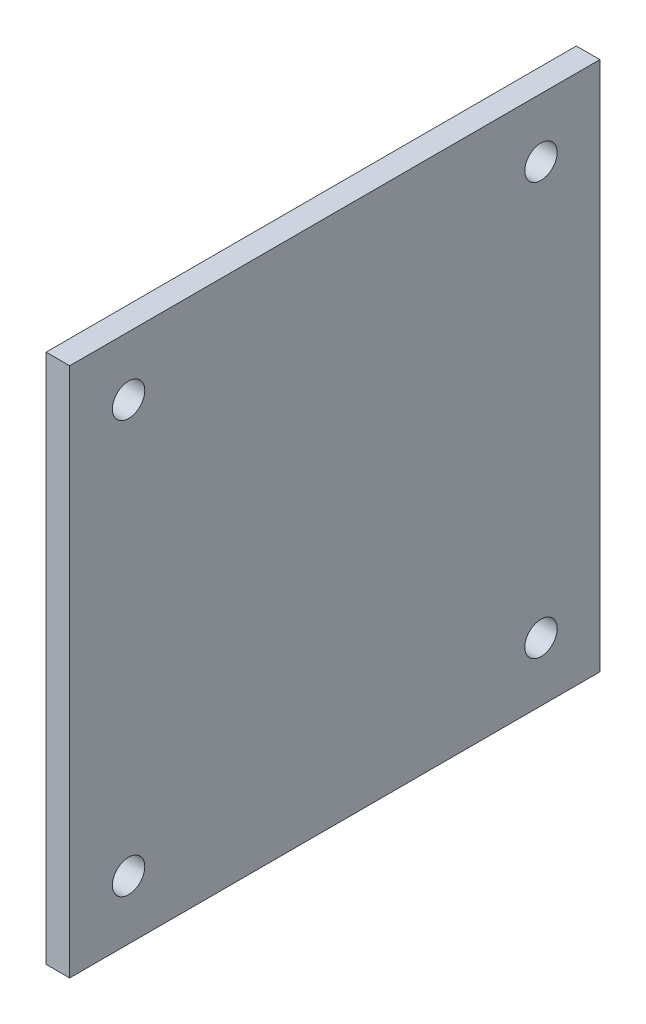
ISO-10303-21;
HEADER;
FILE_DESCRIPTION(('STEP AP214'),'2;1');
FILE_NAME('part.step','',(''),(''),'','','');
FILE_SCHEMA(('AUTOMOTIVE_DESIGN { 1 0 10303 214 1 1 1 1 }'));
ENDSEC;
DATA;
#1=APPLICATION_CONTEXT('core data for automotive mechanical design processes');
#2=APPLICATION_PROTOCOL_DEFINITION('international standard','automotive_design',2000,#1);
#3=PRODUCT_CONTEXT('',#1,'mechanical');
#4=PRODUCT('Part','Part','',(#3));
#5=PRODUCT_RELATED_PRODUCT_CATEGORY('part','',(#4));
#6=PRODUCT_DEFINITION_FORMATION('','',#4);
#7=PRODUCT_DEFINITION_CONTEXT('part definition',#1,'design');
#8=PRODUCT_DEFINITION('design','',#6,#7);
#9=PRODUCT_DEFINITION_SHAPE('','',#8);
#10=(LENGTH_UNIT() NAMED_UNIT(*) SI_UNIT(.MILLI.,.METRE.));
#11=(NAMED_UNIT(*) PLANE_ANGLE_UNIT() SI_UNIT($,.RADIAN.));
#12=(NAMED_UNIT(*) SI_UNIT($,.STERADIAN.) SOLID_ANGLE_UNIT());
#13=UNCERTAINTY_MEASURE_WITH_UNIT(LENGTH_MEASURE(1.E-05),#10,'distance_accuracy_value','');
#14=(GEOMETRIC_REPRESENTATION_CONTEXT(3) GLOBAL_UNCERTAINTY_ASSIGNED_CONTEXT((#13)) GLOBAL_UNIT_ASSIGNED_CONTEXT((#10,
#11,#12)) REPRESENTATION_CONTEXT('',''));
#15=CARTESIAN_POINT('',(0.,0.,0.));
#16=DIRECTION('',(0.,0.,1.));
#17=DIRECTION('',(1.,0.,0.));
#18=AXIS2_PLACEMENT_3D('',#15,#16,#17);
#19=CARTESIAN_POINT('',(-39.2,-18.,18.));
#20=DIRECTION('',(0.,-1.,0.));
#21=DIRECTION('',(0.,0.,-1.));
#22=AXIS2_PLACEMENT_3D('',#19,#20,#21);
#23=PLANE('',#22);
#24=DIRECTION('',(0.,0.,-1.));
#25=VECTOR('',#24,1.);
#26=CARTESIAN_POINT('',(-37.6,-18.,18.));
#27=LINE('',#26,#25);
#28=CARTESIAN_POINT('',(-37.6,-18.,18.));
#29=VERTEX_POINT('',#28);
#30=CARTESIAN_POINT('',(-37.6,-18.,-18.));
#31=VERTEX_POINT('',#30);
#32=EDGE_CURVE('E175',#29,#31,#27,.T.);
#33=ORIENTED_EDGE('',*,*,#32,.F.);
#34=DIRECTION('',(1.,0.,0.));
#35=VECTOR('',#34,1.);
#36=CARTESIAN_POINT('',(-39.2,-18.,18.));
#37=LINE('',#36,#35);
#38=CARTESIAN_POINT('',(-39.2,-18.,18.));
#39=VERTEX_POINT('',#38);
#40=EDGE_CURVE('E11',#39,#29,#37,.T.);
#41=ORIENTED_EDGE('',*,*,#40,.F.);
#42=DIRECTION('',(0.,0.,-1.));
#43=VECTOR('',#42,1.);
#44=CARTESIAN_POINT('',(-39.2,-18.,18.));
#45=LINE('',#44,#43);
#46=CARTESIAN_POINT('',(-39.2,-18.,-18.));
#47=VERTEX_POINT('',#46);
#48=EDGE_CURVE('E176',#39,#47,#45,.T.);
#49=ORIENTED_EDGE('',*,*,#48,.T.);
#50=DIRECTION('',(1.,0.,0.));
#51=VECTOR('',#50,1.);
#52=CARTESIAN_POINT('',(-39.2,-18.,-18.));
#53=LINE('',#52,#51);
#54=EDGE_CURVE('E42',#47,#31,#53,.T.);
#55=ORIENTED_EDGE('',*,*,#54,.T.);
#56=EDGE_LOOP('',(#33,#41,#49,#55));
#57=FACE_BOUND('',#56,.T.);
#58=ADVANCED_FACE('F41',(#57),#23,.T.);
#59=CARTESIAN_POINT('',(-39.2,18.,18.));
#60=DIRECTION('',(0.,0.,1.));
#61=DIRECTION('',(1.,0.,0.));
#62=AXIS2_PLACEMENT_3D('',#59,#60,#61);
#63=PLANE('',#62);
#64=DIRECTION('',(0.,-1.,0.));
#65=VECTOR('',#64,1.);
#66=CARTESIAN_POINT('',(-37.6,18.,18.));
#67=LINE('',#66,#65);
#68=CARTESIAN_POINT('',(-37.6,18.,18.));
#69=VERTEX_POINT('',#68);
#70=EDGE_CURVE('E177',#69,#29,#67,.T.);
#71=ORIENTED_EDGE('',*,*,#70,.F.);
#72=DIRECTION('',(1.,0.,0.));
#73=VECTOR('',#72,1.);
#74=CARTESIAN_POINT('',(-39.2,18.,18.));
#75=LINE('',#74,#73);
#76=CARTESIAN_POINT('',(-39.2,18.,18.));
#77=VERTEX_POINT('',#76);
#78=EDGE_CURVE('E47',#77,#69,#75,.T.);
#79=ORIENTED_EDGE('',*,*,#78,.F.);
#80=DIRECTION('',(0.,-1.,0.));
#81=VECTOR('',#80,1.);
#82=CARTESIAN_POINT('',(-39.2,18.,18.));
#83=LINE('',#82,#81);
#84=EDGE_CURVE('E184',#77,#39,#83,.T.);
#85=ORIENTED_EDGE('',*,*,#84,.T.);
#86=ORIENTED_EDGE('',*,*,#40,.T.);
#87=EDGE_LOOP('',(#71,#79,#85,#86));
#88=FACE_BOUND('',#87,.T.);
#89=ADVANCED_FACE('F203',(#88),#63,.T.);
#90=CARTESIAN_POINT('',(-39.2,18.,-18.));
#91=DIRECTION('',(0.,1.,0.));
#92=DIRECTION('',(0.,0.,1.));
#93=AXIS2_PLACEMENT_3D('',#90,#91,#92);
#94=PLANE('',#93);
#95=DIRECTION('',(0.,0.,1.));
#96=VECTOR('',#95,1.);
#97=CARTESIAN_POINT('',(-37.6,18.,-18.));
#98=LINE('',#97,#96);
#99=CARTESIAN_POINT('',(-37.6,18.,-18.));
#100=VERTEX_POINT('',#99);
#101=EDGE_CURVE('E191',#100,#69,#98,.T.);
#102=ORIENTED_EDGE('',*,*,#101,.F.);
#103=DIRECTION('',(1.,0.,0.));
#104=VECTOR('',#103,1.);
#105=CARTESIAN_POINT('',(-39.2,18.,-18.));
#106=LINE('',#105,#104);
#107=CARTESIAN_POINT('',(-39.2,18.,-18.));
#108=VERTEX_POINT('',#107);
#109=EDGE_CURVE('E198',#108,#100,#106,.T.);
#110=ORIENTED_EDGE('',*,*,#109,.F.);
#111=DIRECTION('',(0.,0.,1.));
#112=VECTOR('',#111,1.);
#113=CARTESIAN_POINT('',(-39.2,18.,-18.));
#114=LINE('',#113,#112);
#115=EDGE_CURVE('E182',#108,#77,#114,.T.);
#116=ORIENTED_EDGE('',*,*,#115,.T.);
#117=ORIENTED_EDGE('',*,*,#78,.T.);
#118=EDGE_LOOP('',(#102,#110,#116,#117));
#119=FACE_BOUND('',#118,.T.);
#120=ADVANCED_FACE('F202',(#119),#94,.T.);
#121=CARTESIAN_POINT('',(-39.2,-18.,-18.));
#122=DIRECTION('',(0.,0.,-1.));
#123=DIRECTION('',(-1.,0.,0.));
#124=AXIS2_PLACEMENT_3D('',#121,#122,#123);
#125=PLANE('',#124);
#126=DIRECTION('',(0.,1.,0.));
#127=VECTOR('',#126,1.);
#128=CARTESIAN_POINT('',(-37.6,-18.,-18.));
#129=LINE('',#128,#127);
#130=EDGE_CURVE('E190',#31,#100,#129,.T.);
#131=ORIENTED_EDGE('',*,*,#130,.F.);
#132=ORIENTED_EDGE('',*,*,#54,.F.);
#133=DIRECTION('',(0.,1.,0.));
#134=VECTOR('',#133,1.);
#135=CARTESIAN_POINT('',(-39.2,-18.,-18.));
#136=LINE('',#135,#134);
#137=EDGE_CURVE('E178',#47,#108,#136,.T.);
#138=ORIENTED_EDGE('',*,*,#137,.T.);
#139=ORIENTED_EDGE('',*,*,#109,.T.);
#140=EDGE_LOOP('',(#131,#132,#138,#139));
#141=FACE_BOUND('',#140,.T.);
#142=ADVANCED_FACE('F196',(#141),#125,.T.);
#143=CARTESIAN_POINT('',(-39.2,0.,0.));
#144=DIRECTION('',(1.,0.,0.));
#145=DIRECTION('',(0.,0.,-1.));
#146=AXIS2_PLACEMENT_3D('',#143,#144,#145);
#147=PLANE('',#146);
#148=DIRECTION('',(0.,-1.,0.));
#149=VECTOR('',#148,1.);
#150=CARTESIAN_POINT('',(-39.2,12.8,11.35));
#151=LINE('',#150,#149);
#152=CARTESIAN_POINT('',(-39.2,12.8,11.35));
#153=VERTEX_POINT('',#152);
#154=CARTESIAN_POINT('',(-39.2,-12.8,11.35));
#155=VERTEX_POINT('',#154);
#156=EDGE_CURVE('E133',#153,#155,#151,.T.);
#157=ORIENTED_EDGE('',*,*,#156,.T.);
#158=DIRECTION('',(0.,0.,-1.));
#159=VECTOR('',#158,1.);
#160=CARTESIAN_POINT('',(-39.2,-12.8,11.35));
#161=LINE('',#160,#159);
#162=CARTESIAN_POINT('',(-39.2,-12.8,-11.35));
#163=VERTEX_POINT('',#162);
#164=EDGE_CURVE('E60',#155,#163,#161,.T.);
#165=ORIENTED_EDGE('',*,*,#164,.T.);
#166=DIRECTION('',(0.,1.,0.));
#167=VECTOR('',#166,1.);
#168=CARTESIAN_POINT('',(-39.2,-12.8,-11.35));
#169=LINE('',#168,#167);
#170=CARTESIAN_POINT('',(-39.2,12.8,-11.35));
#171=VERTEX_POINT('',#170);
#172=EDGE_CURVE('E120',#163,#171,#169,.T.);
#173=ORIENTED_EDGE('',*,*,#172,.T.);
#174=DIRECTION('',(0.,0.,1.));
#175=VECTOR('',#174,1.);
#176=CARTESIAN_POINT('',(-39.2,12.8,-11.35));
#177=LINE('',#176,#175);
#178=EDGE_CURVE('E138',#171,#153,#177,.T.);
#179=ORIENTED_EDGE('',*,*,#178,.T.);
#180=EDGE_LOOP('',(#157,#165,#173,#179));
#181=FACE_BOUND('',#180,.T.);
#182=CARTESIAN_POINT('',(-39.2,14.,14.));
#183=DIRECTION('',(1.,0.,0.));
#184=DIRECTION('',(0.,0.,-1.));
#185=AXIS2_PLACEMENT_3D('',#182,#183,#184);
#186=CIRCLE('',#185,1.1);
#187=CARTESIAN_POINT('',(-39.2,14.,12.9));
#188=VERTEX_POINT('',#187);
#189=EDGE_CURVE('E155',#188,#188,#186,.T.);
#190=ORIENTED_EDGE('',*,*,#189,.T.);
#191=EDGE_LOOP('',(#190));
#192=FACE_BOUND('',#191,.T.);
#193=CARTESIAN_POINT('',(-39.2,14.,-14.));
#194=DIRECTION('',(1.,0.,0.));
#195=DIRECTION('',(0.,0.,-1.));
#196=AXIS2_PLACEMENT_3D('',#193,#194,#195);
#197=CIRCLE('',#196,1.1);
#198=CARTESIAN_POINT('',(-39.2,14.,-15.1));
#199=VERTEX_POINT('',#198);
#200=EDGE_CURVE('E158',#199,#199,#197,.T.);
#201=ORIENTED_EDGE('',*,*,#200,.T.);
#202=EDGE_LOOP('',(#201));
#203=FACE_BOUND('',#202,.T.);
#204=CARTESIAN_POINT('',(-39.2,-14.,14.));
#205=DIRECTION('',(1.,0.,0.));
#206=DIRECTION('',(0.,0.,-1.));
#207=AXIS2_PLACEMENT_3D('',#204,#205,#206);
#208=CIRCLE('',#207,1.1);
#209=CARTESIAN_POINT('',(-39.2,-14.,12.9));
#210=VERTEX_POINT('',#209);
#211=EDGE_CURVE('E163',#210,#210,#208,.T.);
#212=ORIENTED_EDGE('',*,*,#211,.T.);
#213=EDGE_LOOP('',(#212));
#214=FACE_BOUND('',#213,.T.);
#215=CARTESIAN_POINT('',(-39.2,-14.,-14.));
#216=DIRECTION('',(1.,0.,0.));
#217=DIRECTION('',(0.,0.,-1.));
#218=AXIS2_PLACEMENT_3D('',#215,#216,#217);
#219=CIRCLE('',#218,1.1);
#220=CARTESIAN_POINT('',(-39.2,-14.,-15.1));
#221=VERTEX_POINT('',#220);
#222=EDGE_CURVE('E168',#221,#221,#219,.T.);
#223=ORIENTED_EDGE('',*,*,#222,.T.);
#224=EDGE_LOOP('',(#223));
#225=FACE_BOUND('',#224,.T.);
#226=ORIENTED_EDGE('',*,*,#48,.F.);
#227=ORIENTED_EDGE('',*,*,#84,.F.);
#228=ORIENTED_EDGE('',*,*,#115,.F.);
#229=ORIENTED_EDGE('',*,*,#137,.F.);
#230=EDGE_LOOP('',(#226,#227,#228,#229));
#231=FACE_BOUND('',#230,.T.);
#232=ADVANCED_FACE('F210',(#181,#192,#203,#214,#225,#231),#147,.F.);
#233=CARTESIAN_POINT('',(-37.6,0.,0.));
#234=DIRECTION('',(1.,0.,0.));
#235=DIRECTION('',(0.,0.,-1.));
#236=AXIS2_PLACEMENT_3D('',#233,#234,#235);
#237=PLANE('',#236);
#238=CARTESIAN_POINT('',(-37.6,14.,14.));
#239=DIRECTION('',(1.,0.,0.));
#240=DIRECTION('',(0.,0.,-1.));
#241=AXIS2_PLACEMENT_3D('',#238,#239,#240);
#242=CIRCLE('',#241,1.1);
#243=CARTESIAN_POINT('',(-37.6,14.,12.9));
#244=VERTEX_POINT('',#243);
#245=EDGE_CURVE('E146',#244,#244,#242,.T.);
#246=ORIENTED_EDGE('',*,*,#245,.F.);
#247=EDGE_LOOP('',(#246));
#248=FACE_BOUND('',#247,.T.);
#249=CARTESIAN_POINT('',(-37.6,14.,-14.));
#250=DIRECTION('',(1.,0.,0.));
#251=DIRECTION('',(0.,0.,-1.));
#252=AXIS2_PLACEMENT_3D('',#249,#250,#251);
#253=CIRCLE('',#252,1.1);
#254=CARTESIAN_POINT('',(-37.6,14.,-15.1));
#255=VERTEX_POINT('',#254);
#256=EDGE_CURVE('E154',#255,#255,#253,.T.);
#257=ORIENTED_EDGE('',*,*,#256,.F.);
#258=EDGE_LOOP('',(#257));
#259=FACE_BOUND('',#258,.T.);
#260=CARTESIAN_POINT('',(-37.6,-14.,14.));
#261=DIRECTION('',(1.,0.,0.));
#262=DIRECTION('',(0.,0.,-1.));
#263=AXIS2_PLACEMENT_3D('',#260,#261,#262);
#264=CIRCLE('',#263,1.1);
#265=CARTESIAN_POINT('',(-37.6,-14.,12.9));
#266=VERTEX_POINT('',#265);
#267=EDGE_CURVE('E161',#266,#266,#264,.T.);
#268=ORIENTED_EDGE('',*,*,#267,.F.);
#269=EDGE_LOOP('',(#268));
#270=FACE_BOUND('',#269,.T.);
#271=CARTESIAN_POINT('',(-37.6,-14.,-14.));
#272=DIRECTION('',(1.,0.,0.));
#273=DIRECTION('',(0.,0.,-1.));
#274=AXIS2_PLACEMENT_3D('',#271,#272,#273);
#275=CIRCLE('',#274,1.1);
#276=CARTESIAN_POINT('',(-37.6,-14.,-15.1));
#277=VERTEX_POINT('',#276);
#278=EDGE_CURVE('E170',#277,#277,#275,.T.);
#279=ORIENTED_EDGE('',*,*,#278,.F.);
#280=EDGE_LOOP('',(#279));
#281=FACE_BOUND('',#280,.T.);
#282=ORIENTED_EDGE('',*,*,#32,.T.);
#283=ORIENTED_EDGE('',*,*,#130,.T.);
#284=ORIENTED_EDGE('',*,*,#101,.T.);
#285=ORIENTED_EDGE('',*,*,#70,.T.);
#286=EDGE_LOOP('',(#282,#283,#284,#285));
#287=FACE_BOUND('',#286,.T.);
#288=ADVANCED_FACE('F199',(#248,#259,#270,#281,#287),#237,.T.);
#289=CARTESIAN_POINT('',(-39.2,-14.,-14.));
#290=DIRECTION('',(1.,0.,0.));
#291=DIRECTION('',(0.,0.,-1.));
#292=AXIS2_PLACEMENT_3D('',#289,#290,#291);
#293=CYLINDRICAL_SURFACE('',#292,1.1);
#294=ORIENTED_EDGE('',*,*,#222,.F.);
#295=EDGE_LOOP('',(#294));
#296=FACE_BOUND('',#295,.T.);
#297=ORIENTED_EDGE('',*,*,#278,.T.);
#298=EDGE_LOOP('',(#297));
#299=FACE_BOUND('',#298,.T.);
#300=ADVANCED_FACE('F216',(#296,#299),#293,.F.);
#301=CARTESIAN_POINT('',(-39.2,-14.,14.));
#302=DIRECTION('',(1.,0.,0.));
#303=DIRECTION('',(0.,0.,-1.));
#304=AXIS2_PLACEMENT_3D('',#301,#302,#303);
#305=CYLINDRICAL_SURFACE('',#304,1.1);
#306=ORIENTED_EDGE('',*,*,#211,.F.);
#307=EDGE_LOOP('',(#306));
#308=FACE_BOUND('',#307,.T.);
#309=ORIENTED_EDGE('',*,*,#267,.T.);
#310=EDGE_LOOP('',(#309));
#311=FACE_BOUND('',#310,.T.);
#312=ADVANCED_FACE('F249',(#308,#311),#305,.F.);
#313=CARTESIAN_POINT('',(-39.2,14.,-14.));
#314=DIRECTION('',(1.,0.,0.));
#315=DIRECTION('',(0.,0.,-1.));
#316=AXIS2_PLACEMENT_3D('',#313,#314,#315);
#317=CYLINDRICAL_SURFACE('',#316,1.1);
#318=ORIENTED_EDGE('',*,*,#200,.F.);
#319=EDGE_LOOP('',(#318));
#320=FACE_BOUND('',#319,.T.);
#321=ORIENTED_EDGE('',*,*,#256,.T.);
#322=EDGE_LOOP('',(#321));
#323=FACE_BOUND('',#322,.T.);
#324=ADVANCED_FACE('F256',(#320,#323),#317,.F.);
#325=CARTESIAN_POINT('',(-39.2,14.,14.));
#326=DIRECTION('',(1.,0.,0.));
#327=DIRECTION('',(0.,0.,-1.));
#328=AXIS2_PLACEMENT_3D('',#325,#326,#327);
#329=CYLINDRICAL_SURFACE('',#328,1.1);
#330=ORIENTED_EDGE('',*,*,#189,.F.);
#331=EDGE_LOOP('',(#330));
#332=FACE_BOUND('',#331,.T.);
#333=ORIENTED_EDGE('',*,*,#245,.T.);
#334=EDGE_LOOP('',(#333));
#335=FACE_BOUND('',#334,.T.);
#336=ADVANCED_FACE('F266',(#332,#335),#329,.F.);
#337=CARTESIAN_POINT('',(-43.8,-12.8,11.35));
#338=DIRECTION('',(0.,-1.,0.));
#339=DIRECTION('',(0.,0.,-1.));
#340=AXIS2_PLACEMENT_3D('',#337,#338,#339);
#341=PLANE('',#340);
#342=ORIENTED_EDGE('',*,*,#164,.F.);
#343=DIRECTION('',(1.,0.,0.));
#344=VECTOR('',#343,1.);
#345=CARTESIAN_POINT('',(-43.8,-12.8,11.35));
#346=LINE('',#345,#344);
#347=CARTESIAN_POINT('',(-43.8,-12.8,11.35));
#348=VERTEX_POINT('',#347);
#349=EDGE_CURVE('E131',#348,#155,#346,.T.);
#350=ORIENTED_EDGE('',*,*,#349,.F.);
#351=DIRECTION('',(0.,0.,-1.));
#352=VECTOR('',#351,1.);
#353=CARTESIAN_POINT('',(-43.8,-12.8,11.35));
#354=LINE('',#353,#352);
#355=CARTESIAN_POINT('',(-43.8,-12.8,-11.35));
#356=VERTEX_POINT('',#355);
#357=EDGE_CURVE('E126',#348,#356,#354,.T.);
#358=ORIENTED_EDGE('',*,*,#357,.T.);
#359=DIRECTION('',(1.,0.,0.));
#360=VECTOR('',#359,1.);
#361=CARTESIAN_POINT('',(-43.8,-12.8,-11.35));
#362=LINE('',#361,#360);
#363=EDGE_CURVE('E114',#356,#163,#362,.T.);
#364=ORIENTED_EDGE('',*,*,#363,.T.);
#365=EDGE_LOOP('',(#342,#350,#358,#364));
#366=FACE_BOUND('',#365,.T.);
#367=ADVANCED_FACE('F135',(#366),#341,.T.);
#368=CARTESIAN_POINT('',(-43.8,12.8,11.35));
#369=DIRECTION('',(0.,0.,1.));
#370=DIRECTION('',(1.,0.,0.));
#371=AXIS2_PLACEMENT_3D('',#368,#369,#370);
#372=PLANE('',#371);
#373=ORIENTED_EDGE('',*,*,#156,.F.);
#374=DIRECTION('',(1.,0.,0.));
#375=VECTOR('',#374,1.);
#376=CARTESIAN_POINT('',(-43.8,12.8,11.35));
#377=LINE('',#376,#375);
#378=CARTESIAN_POINT('',(-43.8,12.8,11.35));
#379=VERTEX_POINT('',#378);
#380=EDGE_CURVE('E149',#379,#153,#377,.T.);
#381=ORIENTED_EDGE('',*,*,#380,.F.);
#382=DIRECTION('',(0.,-1.,0.));
#383=VECTOR('',#382,1.);
#384=CARTESIAN_POINT('',(-43.8,12.8,11.35));
#385=LINE('',#384,#383);
#386=EDGE_CURVE('E121',#379,#348,#385,.T.);
#387=ORIENTED_EDGE('',*,*,#386,.T.);
#388=ORIENTED_EDGE('',*,*,#349,.T.);
#389=EDGE_LOOP('',(#373,#381,#387,#388));
#390=FACE_BOUND('',#389,.T.);
#391=ADVANCED_FACE('F283',(#390),#372,.T.);
#392=CARTESIAN_POINT('',(-43.8,12.8,-11.35));
#393=DIRECTION('',(0.,1.,0.));
#394=DIRECTION('',(0.,0.,1.));
#395=AXIS2_PLACEMENT_3D('',#392,#393,#394);
#396=PLANE('',#395);
#397=ORIENTED_EDGE('',*,*,#178,.F.);
#398=DIRECTION('',(1.,0.,0.));
#399=VECTOR('',#398,1.);
#400=CARTESIAN_POINT('',(-43.8,12.8,-11.35));
#401=LINE('',#400,#399);
#402=CARTESIAN_POINT('',(-43.8,12.8,-11.35));
#403=VERTEX_POINT('',#402);
#404=EDGE_CURVE('E118',#403,#171,#401,.T.);
#405=ORIENTED_EDGE('',*,*,#404,.F.);
#406=DIRECTION('',(0.,0.,1.));
#407=VECTOR('',#406,1.);
#408=CARTESIAN_POINT('',(-43.8,12.8,-11.35));
#409=LINE('',#408,#407);
#410=EDGE_CURVE('E132',#403,#379,#409,.T.);
#411=ORIENTED_EDGE('',*,*,#410,.T.);
#412=ORIENTED_EDGE('',*,*,#380,.T.);
#413=EDGE_LOOP('',(#397,#405,#411,#412));
#414=FACE_BOUND('',#413,.T.);
#415=ADVANCED_FACE('F294',(#414),#396,.T.);
#416=CARTESIAN_POINT('',(-43.8,-12.8,-11.35));
#417=DIRECTION('',(0.,0.,-1.));
#418=DIRECTION('',(-1.,0.,0.));
#419=AXIS2_PLACEMENT_3D('',#416,#417,#418);
#420=PLANE('',#419);
#421=ORIENTED_EDGE('',*,*,#172,.F.);
#422=ORIENTED_EDGE('',*,*,#363,.F.);
#423=DIRECTION('',(0.,1.,0.));
#424=VECTOR('',#423,1.);
#425=CARTESIAN_POINT('',(-43.8,-12.8,-11.35));
#426=LINE('',#425,#424);
#427=EDGE_CURVE('E117',#356,#403,#426,.T.);
#428=ORIENTED_EDGE('',*,*,#427,.T.);
#429=ORIENTED_EDGE('',*,*,#404,.T.);
#430=EDGE_LOOP('',(#421,#422,#428,#429));
#431=FACE_BOUND('',#430,.T.);
#432=ADVANCED_FACE('F113',(#431),#420,.T.);
#433=CARTESIAN_POINT('',(-43.8,0.,0.));
#434=DIRECTION('',(1.,0.,0.));
#435=DIRECTION('',(0.,0.,-1.));
#436=AXIS2_PLACEMENT_3D('',#433,#434,#435);
#437=PLANE('',#436);
#438=ORIENTED_EDGE('',*,*,#357,.F.);
#439=ORIENTED_EDGE('',*,*,#386,.F.);
#440=ORIENTED_EDGE('',*,*,#410,.F.);
#441=ORIENTED_EDGE('',*,*,#427,.F.);
#442=EDGE_LOOP('',(#438,#439,#440,#441));
#443=FACE_BOUND('',#442,.T.);
#444=ADVANCED_FACE('F127',(#443),#437,.F.);
#445=CLOSED_SHELL('',(#58,#89,#120,#142,#232,#288,#300,#312,#324,#336,#367,#391,#415,#432,#444));
#446=MANIFOLD_SOLID_BREP('B2',#445);
#447=ADVANCED_BREP_SHAPE_REPRESENTATION('',(#18,#446),#14);
#448=SHAPE_DEFINITION_REPRESENTATION(#9,#447);
ENDSEC;
END-ISO-10303-21;
